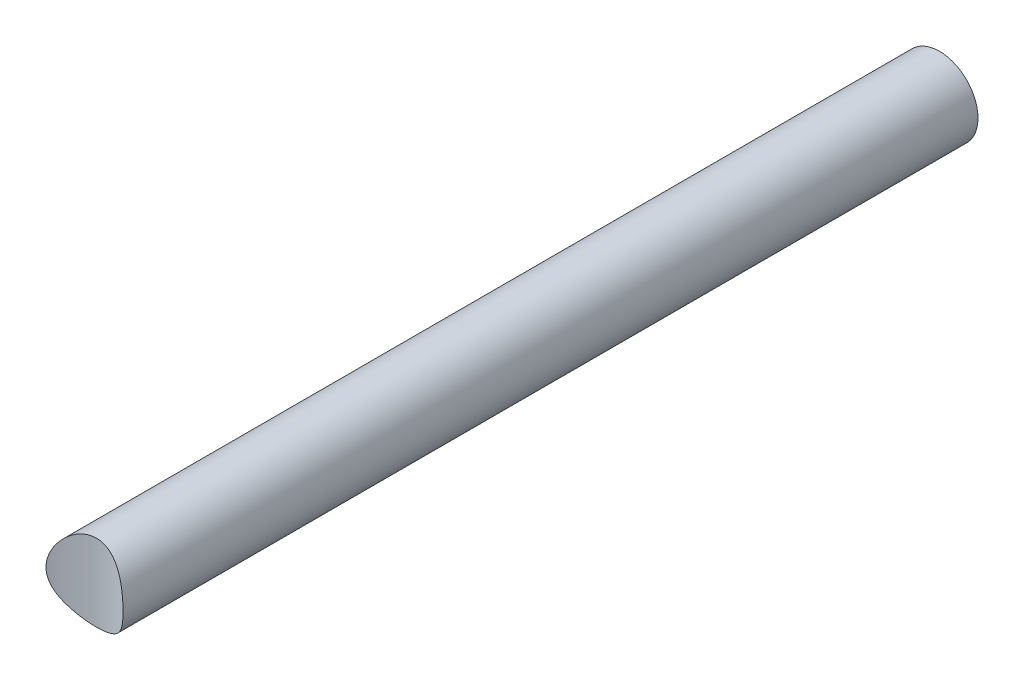
ISO-10303-21;
HEADER;
FILE_DESCRIPTION(('STEP AP214'),'2;1');
FILE_NAME('part.step','',(''),(''),'','','');
FILE_SCHEMA(('AUTOMOTIVE_DESIGN { 1 0 10303 214 1 1 1 1 }'));
ENDSEC;
DATA;
#1=APPLICATION_CONTEXT('core data for automotive mechanical design processes');
#2=APPLICATION_PROTOCOL_DEFINITION('international standard','automotive_design',2000,#1);
#3=PRODUCT_CONTEXT('',#1,'mechanical');
#4=PRODUCT('Part','Part','',(#3));
#5=PRODUCT_RELATED_PRODUCT_CATEGORY('part','',(#4));
#6=PRODUCT_DEFINITION_FORMATION('','',#4);
#7=PRODUCT_DEFINITION_CONTEXT('part definition',#1,'design');
#8=PRODUCT_DEFINITION('design','',#6,#7);
#9=PRODUCT_DEFINITION_SHAPE('','',#8);
#10=(LENGTH_UNIT() NAMED_UNIT(*) SI_UNIT(.MILLI.,.METRE.));
#11=(NAMED_UNIT(*) PLANE_ANGLE_UNIT() SI_UNIT($,.RADIAN.));
#12=(NAMED_UNIT(*) SI_UNIT($,.STERADIAN.) SOLID_ANGLE_UNIT());
#13=UNCERTAINTY_MEASURE_WITH_UNIT(LENGTH_MEASURE(1.E-05),#10,'distance_accuracy_value','');
#14=(GEOMETRIC_REPRESENTATION_CONTEXT(3) GLOBAL_UNCERTAINTY_ASSIGNED_CONTEXT((#13)) GLOBAL_UNIT_ASSIGNED_CONTEXT((#10,
#11,#12)) REPRESENTATION_CONTEXT('',''));
#15=CARTESIAN_POINT('',(0.,0.,0.));
#16=DIRECTION('',(0.,0.,1.));
#17=DIRECTION('',(1.,0.,0.));
#18=AXIS2_PLACEMENT_3D('',#15,#16,#17);
#19=CARTESIAN_POINT('',(60.486,0.61,-25.2));
#20=DIRECTION('',(0.,0.,-1.));
#21=DIRECTION('',(-1.,0.,0.));
#22=AXIS2_PLACEMENT_3D('',#19,#20,#21);
#23=PLANE('',#22);
#24=CARTESIAN_POINT('',(60.486,0.61,-25.2));
#25=DIRECTION('',(0.,0.,1.));
#26=DIRECTION('',(1.,0.,0.));
#27=AXIS2_PLACEMENT_3D('',#24,#25,#26);
#28=CIRCLE('',#27,0.51);
#29=CARTESIAN_POINT('',(60.996,0.61,-25.2));
#30=VERTEX_POINT('',#29);
#31=EDGE_CURVE('E17',#30,#30,#28,.T.);
#32=ORIENTED_EDGE('',*,*,#31,.F.);
#33=EDGE_LOOP('',(#32));
#34=FACE_BOUND('',#33,.T.);
#35=ADVANCED_FACE('F14',(#34),#23,.T.);
#36=CARTESIAN_POINT('',(60.486,2.59,-13.126));
#37=DIRECTION('',(0.,-1.,0.));
#38=DIRECTION('',(0.,0.,-1.));
#39=AXIS2_PLACEMENT_3D('',#36,#37,#38);
#40=CYLINDRICAL_SURFACE('',#39,0.91);
#41=CARTESIAN_POINT('',(59.976,0.61,-13.8796577472567));
#42=CARTESIAN_POINT('',(59.9760011185368,0.636052205303238,-13.8796593820974));
#43=CARTESIAN_POINT('',(59.9780089634663,0.66211320271113,-13.8810291527511));
#44=CARTESIAN_POINT('',(59.9859136943479,0.713386238866981,-13.886286018725));
#45=CARTESIAN_POINT('',(59.9918151205027,0.73859725035127,-13.8901760527624));
#46=CARTESIAN_POINT('',(60.0071450050537,0.787333166129601,-13.8998725218615));
#47=CARTESIAN_POINT('',(60.0165513614189,0.810867558068751,-13.9056669215673));
#48=CARTESIAN_POINT('',(60.0385544914014,0.856016233797825,-13.9184988218288));
#49=CARTESIAN_POINT('',(60.0511522402025,0.877629927954303,-13.9255367021519));
#50=CARTESIAN_POINT('',(60.0807291615114,0.920822820631964,-13.940961184602));
#51=CARTESIAN_POINT('',(60.0980298961423,0.942159041921781,-13.9494117794686));
#52=CARTESIAN_POINT('',(60.1358584780449,0.981823364349335,-13.9661961157182));
#53=CARTESIAN_POINT('',(60.156388301828,1.00014960895578,-13.9745297821044));
#54=CARTESIAN_POINT('',(60.2023446591032,1.03490228367108,-13.9910360376451));
#55=CARTESIAN_POINT('',(60.2280457987454,1.05100844624987,-13.9991263581478));
#56=CARTESIAN_POINT('',(60.2823322838017,1.07855475034935,-14.0133580095976));
#57=CARTESIAN_POINT('',(60.3109153176242,1.08999859499157,-14.0195008864695));
#58=CARTESIAN_POINT('',(60.367561923015,1.10685932899511,-14.0286758771915));
#59=CARTESIAN_POINT('',(60.3954599860796,1.11270877074066,-14.0319295134598));
#60=CARTESIAN_POINT('',(60.4520139834379,1.11966135442778,-14.0358053987185));
#61=CARTESIAN_POINT('',(60.480669301052,1.1207682455447,-14.0364297262755));
#62=CARTESIAN_POINT('',(60.5345773101403,1.11831910414255,-14.0350588961205));
#63=CARTESIAN_POINT('',(60.5598615362827,1.11525645887095,-14.0333408783814));
#64=CARTESIAN_POINT('',(60.6094875832137,1.10546993982705,-14.0279278482239));
#65=CARTESIAN_POINT('',(60.6338293359428,1.09874580217149,-14.0242326933138));
#66=CARTESIAN_POINT('',(60.6812118177706,1.08183883183262,-14.0151460682999));
#67=CARTESIAN_POINT('',(60.7042372879167,1.07162243000276,-14.0097381731348));
#68=CARTESIAN_POINT('',(60.7482887984998,1.04809679323242,-13.9976804894111));
#69=CARTESIAN_POINT('',(60.7693142289042,1.03478661889524,-13.9910303237687));
#70=CARTESIAN_POINT('',(60.8112525500908,1.00378161059526,-13.9762107222897));
#71=CARTESIAN_POINT('',(60.8318968476062,0.985764964851742,-13.9679546132987));
#72=CARTESIAN_POINT('',(60.8700346476845,0.946695570439285,-13.9512586355128));
#73=CARTESIAN_POINT('',(60.8875243117843,0.925639178413368,-13.9428185566726));
#74=CARTESIAN_POINT('',(60.9204943650623,0.878723211122358,-13.9258061578031));
#75=CARTESIAN_POINT('',(60.9356324840402,0.852598373825538,-13.9172956707104));
#76=CARTESIAN_POINT('',(60.9611898079464,0.797638473514649,-13.9022194720712));
#77=CARTESIAN_POINT('',(60.9716188142144,0.768809191976336,-13.8956497310951));
#78=CARTESIAN_POINT('',(60.9848634973058,0.718171554037159,-13.8871025459494));
#79=CARTESIAN_POINT('',(60.9890233934759,0.696842775221434,-13.8843392513197));
#80=CARTESIAN_POINT('',(60.9945913374499,0.653677862087578,-13.8806166755357));
#81=CARTESIAN_POINT('',(60.9960009377749,0.631842021051136,-13.8796563766154));
#82=CARTESIAN_POINT('',(60.9959988814632,0.583947794696761,-13.8796593820974));
#83=CARTESIAN_POINT('',(60.9939910365337,0.55788679728887,-13.8810291527511));
#84=CARTESIAN_POINT('',(60.9860863056521,0.506613761133019,-13.886286018725));
#85=CARTESIAN_POINT('',(60.9801848794973,0.48140274964873,-13.8901760527624));
#86=CARTESIAN_POINT('',(60.9648549949463,0.432666833870398,-13.8998725218615));
#87=CARTESIAN_POINT('',(60.9554486385811,0.409132441931247,-13.9056669215673));
#88=CARTESIAN_POINT('',(60.9334455085986,0.363983766202173,-13.9184988218288));
#89=CARTESIAN_POINT('',(60.9208477597975,0.342370072045697,-13.9255367021519));
#90=CARTESIAN_POINT('',(60.8912708384886,0.299177179368037,-13.940961184602));
#91=CARTESIAN_POINT('',(60.8739701038577,0.277840958078219,-13.9494117794686));
#92=CARTESIAN_POINT('',(60.8361415219551,0.238176635650665,-13.9661961157182));
#93=CARTESIAN_POINT('',(60.815611698172,0.219850391044218,-13.9745297821044));
#94=CARTESIAN_POINT('',(60.7696553408968,0.185097716328924,-13.9910360376451));
#95=CARTESIAN_POINT('',(60.7439542012546,0.168991553750137,-13.9991263581478));
#96=CARTESIAN_POINT('',(60.6896677161983,0.141445249650653,-14.0133580095976));
#97=CARTESIAN_POINT('',(60.6610846823758,0.13000140500843,-14.0195008864695));
#98=CARTESIAN_POINT('',(60.604438076985,0.113140671004891,-14.0286758771915));
#99=CARTESIAN_POINT('',(60.5765400139204,0.107291229259342,-14.0319295134598));
#100=CARTESIAN_POINT('',(60.5199860165621,0.100338645572216,-14.0358053987185));
#101=CARTESIAN_POINT('',(60.491330698948,0.099231754455301,-14.0364297262755));
#102=CARTESIAN_POINT('',(60.4374226898597,0.101680895857451,-14.0350588961205));
#103=CARTESIAN_POINT('',(60.4121384637173,0.104743541129052,-14.0333408783814));
#104=CARTESIAN_POINT('',(60.3625124167863,0.114530060172953,-14.0279278482239));
#105=CARTESIAN_POINT('',(60.3381706640572,0.121254197828514,-14.0242326933138));
#106=CARTESIAN_POINT('',(60.2907881822294,0.138161168167378,-14.0151460682999));
#107=CARTESIAN_POINT('',(60.2677627120833,0.148377569997242,-14.0097381731348));
#108=CARTESIAN_POINT('',(60.2237112015002,0.17190320676758,-13.9976804894111));
#109=CARTESIAN_POINT('',(60.2026857710958,0.185213381104765,-13.9910303237687));
#110=CARTESIAN_POINT('',(60.1607474499092,0.216218389404746,-13.9762107222897));
#111=CARTESIAN_POINT('',(60.1401031523938,0.234235035148259,-13.9679546132987));
#112=CARTESIAN_POINT('',(60.1019653523155,0.273304429560716,-13.9512586355128));
#113=CARTESIAN_POINT('',(60.0844756882157,0.294360821586633,-13.9428185566726));
#114=CARTESIAN_POINT('',(60.0515056349377,0.341276788877642,-13.9258061578031));
#115=CARTESIAN_POINT('',(60.0363675159598,0.367401626174462,-13.9172956707104));
#116=CARTESIAN_POINT('',(60.0108101920536,0.422361526485351,-13.9022194720712));
#117=CARTESIAN_POINT('',(60.0003811857856,0.451190808023664,-13.8956497310951));
#118=CARTESIAN_POINT('',(59.9871365026942,0.50182844596284,-13.8871025459494));
#119=CARTESIAN_POINT('',(59.9829766065241,0.523157224778565,-13.8843392513197));
#120=CARTESIAN_POINT('',(59.9774086625501,0.566322137912422,-13.8806166755357));
#121=CARTESIAN_POINT('',(59.9759990622251,0.588157978948864,-13.8796563766154));
#122=CARTESIAN_POINT('',(59.976,0.61,-13.8796577472567));
#123=B_SPLINE_CURVE_WITH_KNOTS('',3,(#41,#42,#43,#44,#45,#46,#47,#48,#49,#50,#51,#52,#53,#54,
#55,#56,#57,#58,#59,#60,#61,#62,#63,#64,#65,#66,#67,#68,#69,#70,#71,#72,#73,#74,#75,#76,#77,#78,
#79,#80,#81,#82,#83,#84,#85,#86,#87,#88,#89,#90,#91,#92,#93,#94,#95,#96,#97,#98,#99,#100,#101,
#102,#103,#104,#105,#106,#107,#108,#109,#110,#111,#112,#113,#114,#115,#116,#117,#118,#119,#120,
#121,#122),.UNSPECIFIED.,.T.,.F.,(4,2,2,2,2,2,2,2,2,2,2,2,2,2,2,2,2,2,2,2,2,2,2,2,2,2,2,2,2,2,2,
2,2,2,2,2,2,2,2,2,4),(0.,0.0780652846652815,0.156221760472622,0.233893501569413,
0.311589005267886,0.397460596556616,0.483384955504667,0.577056409990688,0.670653318674956,
0.756226865164539,0.841732749857803,0.917951760269803,0.994176264502731,1.07115509561728,
1.14815733127937,1.23365911701388,1.31926424706791,1.41289781869889,1.50633559693077,
1.57182206581107,1.63727155736754,1.71533684203283,1.79349331784017,1.87116505893696,
1.94886056263543,2.03473215392416,2.12065651287221,2.21432796735823,2.3079248760425,
2.39349842253209,2.47900430722535,2.55522331763735,2.63144782187028,2.70842665298484,
2.78542888864692,2.87093067438143,2.95653580443545,3.05016937606644,3.14360715429832,
3.20909362317861,3.27454311473509),.UNSPECIFIED.);
#124=CARTESIAN_POINT('',(59.976,0.61,-13.8796577472567));
#125=VERTEX_POINT('',#124);
#126=EDGE_CURVE('E10',#125,#125,#123,.T.);
#127=ORIENTED_EDGE('',*,*,#126,.F.);
#128=EDGE_LOOP('',(#127));
#129=FACE_BOUND('',#128,.T.);
#130=ADVANCED_FACE('F28',(#129),#40,.F.);
#131=CARTESIAN_POINT('',(60.486,0.61,-9.526));
#132=DIRECTION('',(0.,0.,1.));
#133=DIRECTION('',(1.,0.,0.));
#134=AXIS2_PLACEMENT_3D('',#131,#132,#133);
#135=CYLINDRICAL_SURFACE('',#134,0.51);
#136=ORIENTED_EDGE('',*,*,#31,.T.);
#137=EDGE_LOOP('',(#136));
#138=FACE_BOUND('',#137,.T.);
#139=ORIENTED_EDGE('',*,*,#126,.T.);
#140=EDGE_LOOP('',(#139));
#141=FACE_BOUND('',#140,.T.);
#142=ADVANCED_FACE('F30',(#138,#141),#135,.T.);
#143=CLOSED_SHELL('',(#35,#130,#142));
#144=MANIFOLD_SOLID_BREP('B1',#143);
#145=ADVANCED_BREP_SHAPE_REPRESENTATION('',(#18,#144),#14);
#146=SHAPE_DEFINITION_REPRESENTATION(#9,#145);
ENDSEC;
END-ISO-10303-21;
